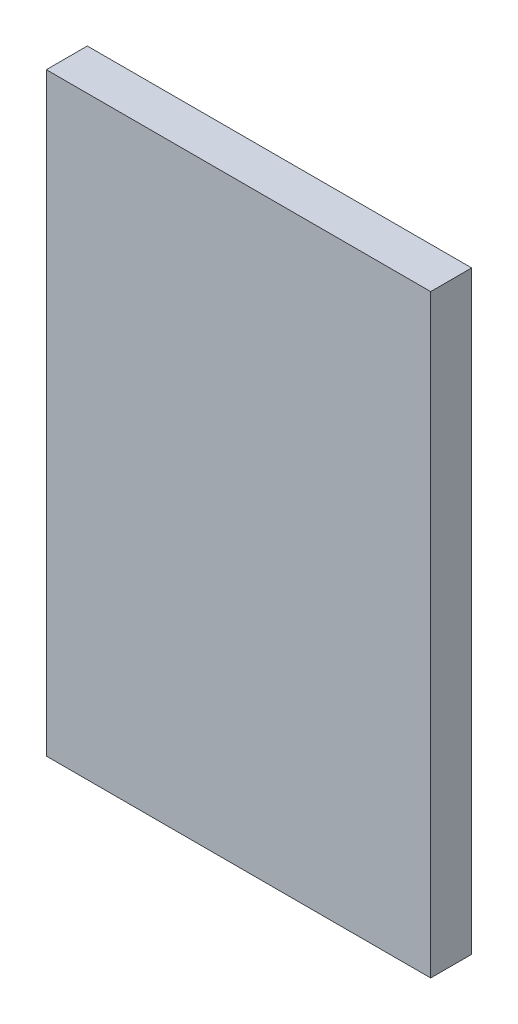
ISO-10303-21;
HEADER;
FILE_DESCRIPTION(('STEP AP214'),'2;1');
FILE_NAME('part.step','',(''),(''),'','','');
FILE_SCHEMA(('AUTOMOTIVE_DESIGN { 1 0 10303 214 1 1 1 1 }'));
ENDSEC;
DATA;
#1=APPLICATION_CONTEXT('core data for automotive mechanical design processes');
#2=APPLICATION_PROTOCOL_DEFINITION('international standard','automotive_design',2000,#1);
#3=PRODUCT_CONTEXT('',#1,'mechanical');
#4=PRODUCT('Part','Part','',(#3));
#5=PRODUCT_RELATED_PRODUCT_CATEGORY('part','',(#4));
#6=PRODUCT_DEFINITION_FORMATION('','',#4);
#7=PRODUCT_DEFINITION_CONTEXT('part definition',#1,'design');
#8=PRODUCT_DEFINITION('design','',#6,#7);
#9=PRODUCT_DEFINITION_SHAPE('','',#8);
#10=(LENGTH_UNIT() NAMED_UNIT(*) SI_UNIT(.MILLI.,.METRE.));
#11=(NAMED_UNIT(*) PLANE_ANGLE_UNIT() SI_UNIT($,.RADIAN.));
#12=(NAMED_UNIT(*) SI_UNIT($,.STERADIAN.) SOLID_ANGLE_UNIT());
#13=UNCERTAINTY_MEASURE_WITH_UNIT(LENGTH_MEASURE(1.E-05),#10,'distance_accuracy_value','');
#14=(GEOMETRIC_REPRESENTATION_CONTEXT(3) GLOBAL_UNCERTAINTY_ASSIGNED_CONTEXT((#13)) GLOBAL_UNIT_ASSIGNED_CONTEXT((#10,
#11,#12)) REPRESENTATION_CONTEXT('',''));
#15=CARTESIAN_POINT('',(0.,0.,0.));
#16=DIRECTION('',(0.,0.,1.));
#17=DIRECTION('',(1.,0.,0.));
#18=AXIS2_PLACEMENT_3D('',#15,#16,#17);
#19=CARTESIAN_POINT('',(0.,0.,4.));
#20=DIRECTION('',(-1.,0.,0.));
#21=DIRECTION('',(0.,0.,1.));
#22=AXIS2_PLACEMENT_3D('',#19,#20,#21);
#23=PLANE('',#22);
#24=DIRECTION('',(0.,1.,0.));
#25=VECTOR('',#24,1.);
#26=CARTESIAN_POINT('',(0.,0.,0.));
#27=LINE('',#26,#25);
#28=CARTESIAN_POINT('',(0.,0.,0.));
#29=VERTEX_POINT('',#28);
#30=CARTESIAN_POINT('',(0.,58.,0.));
#31=VERTEX_POINT('',#30);
#32=EDGE_CURVE('E107',#29,#31,#27,.T.);
#33=ORIENTED_EDGE('',*,*,#32,.T.);
#34=DIRECTION('',(0.,0.,-1.));
#35=VECTOR('',#34,1.);
#36=CARTESIAN_POINT('',(0.,58.,4.));
#37=LINE('',#36,#35);
#38=CARTESIAN_POINT('',(0.,58.,4.));
#39=VERTEX_POINT('',#38);
#40=EDGE_CURVE('E11',#39,#31,#37,.T.);
#41=ORIENTED_EDGE('',*,*,#40,.F.);
#42=DIRECTION('',(0.,1.,0.));
#43=VECTOR('',#42,1.);
#44=CARTESIAN_POINT('',(0.,0.,4.));
#45=LINE('',#44,#43);
#46=CARTESIAN_POINT('',(0.,0.,4.));
#47=VERTEX_POINT('',#46);
#48=EDGE_CURVE('E91',#47,#39,#45,.T.);
#49=ORIENTED_EDGE('',*,*,#48,.F.);
#50=DIRECTION('',(0.,0.,-1.));
#51=VECTOR('',#50,1.);
#52=CARTESIAN_POINT('',(0.,0.,4.));
#53=LINE('',#52,#51);
#54=EDGE_CURVE('E103',#47,#29,#53,.T.);
#55=ORIENTED_EDGE('',*,*,#54,.T.);
#56=EDGE_LOOP('',(#33,#41,#49,#55));
#57=FACE_BOUND('',#56,.T.);
#58=ADVANCED_FACE('F39',(#57),#23,.F.);
#59=CARTESIAN_POINT('',(0.,58.,4.));
#60=DIRECTION('',(0.,-1.,0.));
#61=DIRECTION('',(1.,0.,0.));
#62=AXIS2_PLACEMENT_3D('',#59,#60,#61);
#63=PLANE('',#62);
#64=DIRECTION('',(-1.,0.,0.));
#65=VECTOR('',#64,1.);
#66=CARTESIAN_POINT('',(0.,58.,0.));
#67=LINE('',#66,#65);
#68=CARTESIAN_POINT('',(-37.5,58.,0.));
#69=VERTEX_POINT('',#68);
#70=EDGE_CURVE('E96',#31,#69,#67,.T.);
#71=ORIENTED_EDGE('',*,*,#70,.T.);
#72=DIRECTION('',(0.,0.,-1.));
#73=VECTOR('',#72,1.);
#74=CARTESIAN_POINT('',(-37.5,58.,4.));
#75=LINE('',#74,#73);
#76=CARTESIAN_POINT('',(-37.5,58.,4.));
#77=VERTEX_POINT('',#76);
#78=EDGE_CURVE('E48',#77,#69,#75,.T.);
#79=ORIENTED_EDGE('',*,*,#78,.F.);
#80=DIRECTION('',(-1.,0.,0.));
#81=VECTOR('',#80,1.);
#82=CARTESIAN_POINT('',(0.,58.,4.));
#83=LINE('',#82,#81);
#84=EDGE_CURVE('E86',#39,#77,#83,.T.);
#85=ORIENTED_EDGE('',*,*,#84,.F.);
#86=ORIENTED_EDGE('',*,*,#40,.T.);
#87=EDGE_LOOP('',(#71,#79,#85,#86));
#88=FACE_BOUND('',#87,.T.);
#89=ADVANCED_FACE('F95',(#88),#63,.F.);
#90=CARTESIAN_POINT('',(-37.5,0.,4.));
#91=DIRECTION('',(1.,0.,0.));
#92=DIRECTION('',(0.,0.,-1.));
#93=AXIS2_PLACEMENT_3D('',#90,#91,#92);
#94=PLANE('',#93);
#95=DIRECTION('',(0.,-1.,0.));
#96=VECTOR('',#95,1.);
#97=CARTESIAN_POINT('',(-37.5,0.,0.));
#98=LINE('',#97,#96);
#99=CARTESIAN_POINT('',(-37.5,0.,0.));
#100=VERTEX_POINT('',#99);
#101=EDGE_CURVE('E73',#69,#100,#98,.T.);
#102=ORIENTED_EDGE('',*,*,#101,.T.);
#103=DIRECTION('',(0.,0.,-1.));
#104=VECTOR('',#103,1.);
#105=CARTESIAN_POINT('',(-37.5,0.,4.));
#106=LINE('',#105,#104);
#107=CARTESIAN_POINT('',(-37.5,0.,4.));
#108=VERTEX_POINT('',#107);
#109=EDGE_CURVE('E98',#108,#100,#106,.T.);
#110=ORIENTED_EDGE('',*,*,#109,.F.);
#111=DIRECTION('',(0.,-1.,0.));
#112=VECTOR('',#111,1.);
#113=CARTESIAN_POINT('',(-37.5,0.,4.));
#114=LINE('',#113,#112);
#115=EDGE_CURVE('E89',#77,#108,#114,.T.);
#116=ORIENTED_EDGE('',*,*,#115,.F.);
#117=ORIENTED_EDGE('',*,*,#78,.T.);
#118=EDGE_LOOP('',(#102,#110,#116,#117));
#119=FACE_BOUND('',#118,.T.);
#120=ADVANCED_FACE('F99',(#119),#94,.F.);
#121=CARTESIAN_POINT('',(0.,0.,4.));
#122=DIRECTION('',(0.,1.,0.));
#123=DIRECTION('',(-1.,0.,0.));
#124=AXIS2_PLACEMENT_3D('',#121,#122,#123);
#125=PLANE('',#124);
#126=DIRECTION('',(1.,0.,0.));
#127=VECTOR('',#126,1.);
#128=CARTESIAN_POINT('',(0.,0.,0.));
#129=LINE('',#128,#127);
#130=EDGE_CURVE('E79',#100,#29,#129,.T.);
#131=ORIENTED_EDGE('',*,*,#130,.T.);
#132=ORIENTED_EDGE('',*,*,#54,.F.);
#133=DIRECTION('',(1.,0.,0.));
#134=VECTOR('',#133,1.);
#135=CARTESIAN_POINT('',(0.,0.,4.));
#136=LINE('',#135,#134);
#137=EDGE_CURVE('E56',#108,#47,#136,.T.);
#138=ORIENTED_EDGE('',*,*,#137,.F.);
#139=ORIENTED_EDGE('',*,*,#109,.T.);
#140=EDGE_LOOP('',(#131,#132,#138,#139));
#141=FACE_BOUND('',#140,.T.);
#142=ADVANCED_FACE('F120',(#141),#125,.F.);
#143=CARTESIAN_POINT('',(0.,0.,4.));
#144=DIRECTION('',(0.,0.,1.));
#145=DIRECTION('',(1.,0.,0.));
#146=AXIS2_PLACEMENT_3D('',#143,#144,#145);
#147=PLANE('',#146);
#148=ORIENTED_EDGE('',*,*,#48,.T.);
#149=ORIENTED_EDGE('',*,*,#84,.T.);
#150=ORIENTED_EDGE('',*,*,#115,.T.);
#151=ORIENTED_EDGE('',*,*,#137,.T.);
#152=EDGE_LOOP('',(#148,#149,#150,#151));
#153=FACE_BOUND('',#152,.T.);
#154=ADVANCED_FACE('F87',(#153),#147,.T.);
#155=CARTESIAN_POINT('',(0.,0.,0.));
#156=DIRECTION('',(0.,0.,1.));
#157=DIRECTION('',(1.,0.,0.));
#158=AXIS2_PLACEMENT_3D('',#155,#156,#157);
#159=PLANE('',#158);
#160=ORIENTED_EDGE('',*,*,#32,.F.);
#161=ORIENTED_EDGE('',*,*,#130,.F.);
#162=ORIENTED_EDGE('',*,*,#101,.F.);
#163=ORIENTED_EDGE('',*,*,#70,.F.);
#164=EDGE_LOOP('',(#160,#161,#162,#163));
#165=FACE_BOUND('',#164,.T.);
#166=ADVANCED_FACE('F123',(#165),#159,.F.);
#167=CLOSED_SHELL('',(#58,#89,#120,#142,#154,#166));
#168=MANIFOLD_SOLID_BREP('B2',#167);
#169=ADVANCED_BREP_SHAPE_REPRESENTATION('',(#18,#168),#14);
#170=SHAPE_DEFINITION_REPRESENTATION(#9,#169);
ENDSEC;
END-ISO-10303-21;
